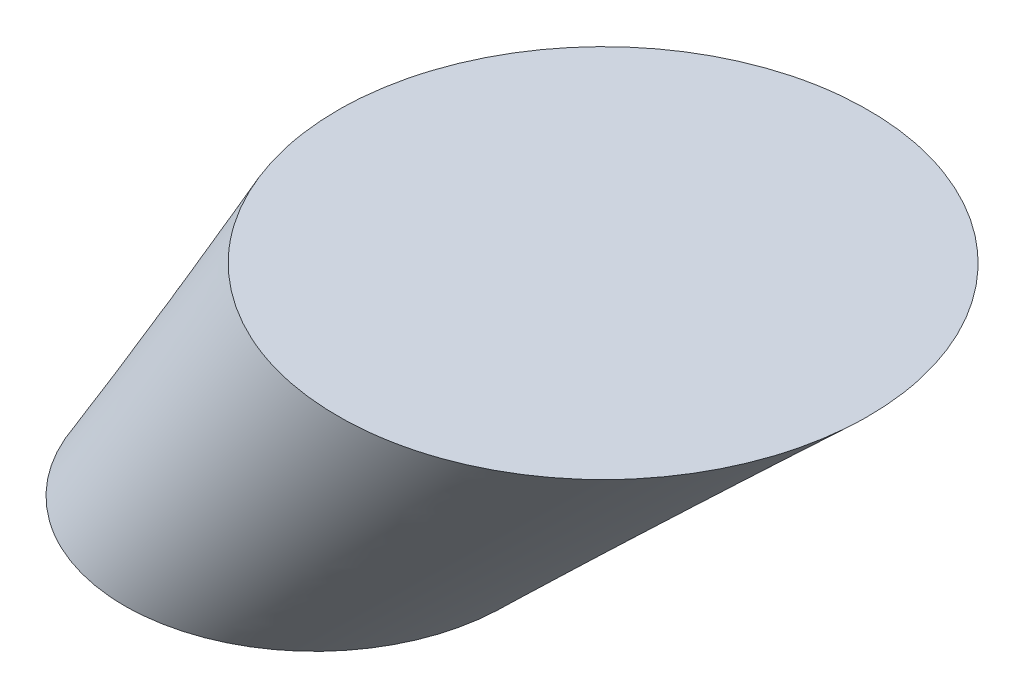
ISO-10303-21;
HEADER;
FILE_DESCRIPTION(('STEP AP214'),'2;1');
FILE_NAME('part.step','',(''),(''),'','','');
FILE_SCHEMA(('AUTOMOTIVE_DESIGN { 1 0 10303 214 1 1 1 1 }'));
ENDSEC;
DATA;
#1=APPLICATION_CONTEXT('core data for automotive mechanical design processes');
#2=APPLICATION_PROTOCOL_DEFINITION('international standard','automotive_design',2000,#1);
#3=PRODUCT_CONTEXT('',#1,'mechanical');
#4=PRODUCT('Part','Part','',(#3));
#5=PRODUCT_RELATED_PRODUCT_CATEGORY('part','',(#4));
#6=PRODUCT_DEFINITION_FORMATION('','',#4);
#7=PRODUCT_DEFINITION_CONTEXT('part definition',#1,'design');
#8=PRODUCT_DEFINITION('design','',#6,#7);
#9=PRODUCT_DEFINITION_SHAPE('','',#8);
#10=(LENGTH_UNIT() NAMED_UNIT(*) SI_UNIT(.MILLI.,.METRE.));
#11=(NAMED_UNIT(*) PLANE_ANGLE_UNIT() SI_UNIT($,.RADIAN.));
#12=(NAMED_UNIT(*) SI_UNIT($,.STERADIAN.) SOLID_ANGLE_UNIT());
#13=UNCERTAINTY_MEASURE_WITH_UNIT(LENGTH_MEASURE(1.E-05),#10,'distance_accuracy_value','');
#14=(GEOMETRIC_REPRESENTATION_CONTEXT(3) GLOBAL_UNCERTAINTY_ASSIGNED_CONTEXT((#13)) GLOBAL_UNIT_ASSIGNED_CONTEXT((#10,
#11,#12)) REPRESENTATION_CONTEXT('',''));
#15=CARTESIAN_POINT('',(0.,0.,0.));
#16=DIRECTION('',(0.,0.,1.));
#17=DIRECTION('',(1.,0.,0.));
#18=AXIS2_PLACEMENT_3D('',#15,#16,#17);
#19=CARTESIAN_POINT('',(0.,0.,0.));
#20=DIRECTION('',(0.,1.,0.));
#21=DIRECTION('',(0.,0.,1.));
#22=AXIS2_PLACEMENT_3D('',#19,#20,#21);
#23=PLANE('',#22);
#24=CARTESIAN_POINT('',(0.,0.,0.));
#25=DIRECTION('',(0.,1.,0.));
#26=DIRECTION('',(0.,0.,1.));
#27=AXIS2_PLACEMENT_3D('',#24,#25,#26);
#28=CIRCLE('',#27,23.);
#29=CARTESIAN_POINT('',(1.0525513510452,0.,-22.9759033696917));
#30=VERTEX_POINT('',#29);
#31=EDGE_CURVE('E11',#30,#30,#28,.T.);
#32=ORIENTED_EDGE('',*,*,#31,.T.);
#33=EDGE_LOOP('',(#32));
#34=FACE_BOUND('',#33,.T.);
#35=ADVANCED_FACE('F43',(#34),#23,.T.);
#36=CARTESIAN_POINT('',(-25.0000000000002,-29.9999999999998,0.));
#37=DIRECTION('',(0.,-1.,0.));
#38=DIRECTION('',(1.,0.,0.));
#39=AXIS2_PLACEMENT_3D('',#36,#37,#38);
#40=PLANE('',#39);
#41=CARTESIAN_POINT('',(-25.0000000000002,-29.9999999999998,0.));
#42=DIRECTION('',(0.,-1.,0.));
#43=DIRECTION('',(1.,0.,0.));
#44=AXIS2_PLACEMENT_3D('',#41,#42,#43);
#45=CIRCLE('',#44,16.5);
#46=CARTESIAN_POINT('',(-20.6660977349119,-29.9999999999999,-15.9206561157718));
#47=VERTEX_POINT('',#46);
#48=EDGE_CURVE('E51',#47,#47,#45,.T.);
#49=ORIENTED_EDGE('',*,*,#48,.T.);
#50=EDGE_LOOP('',(#49));
#51=FACE_BOUND('',#50,.T.);
#52=ADVANCED_FACE('F73',(#51),#40,.T.);
#53=CARTESIAN_POINT('',(-20.6660977349119,-29.9999999999999,-15.9206561157718));
#54=CARTESIAN_POINT('',(1.0525513510452,0.,-22.9759033696917));
#55=CARTESIAN_POINT('',(-21.3294584064024,-29.9999999999998,-16.1012353768172));
#56=CARTESIAN_POINT('',(0.0952220439747073,0.,-23.0197596759853));
#57=CARTESIAN_POINT('',(-22.0458919478098,-29.9999999999999,-16.2520680040292));
#58=CARTESIAN_POINT('',(-0.925255639325973,0.,-23.0070057051759));
#59=CARTESIAN_POINT('',(-23.5897326193886,-29.9999999999998,-16.4580562250464));
#60=CARTESIAN_POINT('',(-3.08806824082118,0.,-22.8175862890038));
#61=CARTESIAN_POINT('',(-24.4173803376454,-29.9999999999998,-16.5131751740553));
#62=CARTESIAN_POINT('',(-4.23071929380648,0.,-22.6407978076773));
#63=CARTESIAN_POINT('',(-26.1770947382177,-29.9999999999998,-16.481469836676));
#64=CARTESIAN_POINT('',(-6.61488799921413,0.,-22.0623654187162));
#65=CARTESIAN_POINT('',(-27.1094493502356,-29.9999999999998,-16.3944465528839));
#66=CARTESIAN_POINT('',(-7.85673679981556,0.,-21.6603632188023));
#67=CARTESIAN_POINT('',(-29.0522002521926,-29.9999999999998,-16.0252091235249));
#68=CARTESIAN_POINT('',(-10.3872210279229,0.,-20.5670923377393));
#69=CARTESIAN_POINT('',(-30.0628141072813,-29.9999999999998,-15.7425510421633));
#70=CARTESIAN_POINT('',(-11.6760173738869,0.,-19.8751535691125));
#71=CARTESIAN_POINT('',(-32.107729607504,-29.9999999999998,-14.9311814611776));
#72=CARTESIAN_POINT('',(-14.2109845080709,0.,-18.1493534436486));
#73=CARTESIAN_POINT('',(-33.1419543637754,-29.9999999999998,-14.4017971047897));
#74=CARTESIAN_POINT('',(-15.4568460191973,0.,-17.1146001609598));
#75=CARTESIAN_POINT('',(-35.1486970785049,-29.9999999999998,-13.0654938030706));
#76=CARTESIAN_POINT('',(-17.7802011173199,0.,-14.6863227445933));
#77=CARTESIAN_POINT('',(-36.1206166929638,-29.9999999999998,-12.257920902527));
#78=CARTESIAN_POINT('',(-18.8566818197173,0.,-13.2920910234508));
#79=CARTESIAN_POINT('',(-37.8956919677274,-29.9999999999997,-10.3742888507082));
#80=CARTESIAN_POINT('',(-20.6983934434609,0.,-10.18973217928));
#81=CARTESIAN_POINT('',(-38.6977691413284,-29.9999999999997,-9.29806538798053));
#82=CARTESIAN_POINT('',(-21.4621072707619,0.,-8.48170961039923));
#83=CARTESIAN_POINT('',(-40.0301969833555,-29.9999999999997,-6.94089893672445));
#84=CARTESIAN_POINT('',(-22.557618596126,0.,-4.8698346674751));
#85=CARTESIAN_POINT('',(-40.5594975936814,-29.9999999999997,-5.66062360806928));
#86=CARTESIAN_POINT('',(-22.8881907571047,0.,-2.96720996518618));
#87=CARTESIAN_POINT('',(-41.2818146378627,-29.9999999999997,-3.00718092210731));
#88=CARTESIAN_POINT('',(-23.0636159822789,0.,0.862107263095771));
#89=CARTESIAN_POINT('',(-41.4744891464902,-29.9999999999997,-1.63526963234416));
#90=CARTESIAN_POINT('',(-22.9083860049477,0.,2.78698709454288));
#91=CARTESIAN_POINT('',(-41.5207038238191,-29.9999999999997,1.07202825239912));
#92=CARTESIAN_POINT('',(-22.1476981152771,0.,6.48389656081773));
#93=CARTESIAN_POINT('',(-41.3748107410854,-29.9999999999997,2.40630706229899));
#94=CARTESIAN_POINT('',(-21.543348161255,0.,8.25459163306771));
#95=CARTESIAN_POINT('',(-40.799431595066,-29.9999999999997,4.92977704944809));
#96=CARTESIAN_POINT('',(-19.9930002333024,0.,11.5123444483271));
#97=CARTESIAN_POINT('',(-40.3709584930705,-29.9999999999997,6.11856320663901));
#98=CARTESIAN_POINT('',(-19.0485034396152,0.,12.999159366731));
#99=CARTESIAN_POINT('',(-39.3184495916337,-29.9999999999997,8.28765238177718));
#100=CARTESIAN_POINT('',(-16.9568979352675,0.,15.6296909740284));
#101=CARTESIAN_POINT('',(-38.6952610504383,-29.9999999999997,9.26821583479557));
#102=CARTESIAN_POINT('',(-15.8108625616596,0.,16.7740196782829));
#103=CARTESIAN_POINT('',(-37.3437699126296,-29.9999999999997,11.0041512323334));
#104=CARTESIAN_POINT('',(-13.4443036436428,0.,18.7243640919697));
#105=CARTESIAN_POINT('',(-36.615874650953,-29.9999999999997,11.7600642187841));
#106=CARTESIAN_POINT('',(-12.2241696299743,0.,19.5312397140999));
#107=CARTESIAN_POINT('',(-35.1283448933657,-29.9999999999998,13.063088610953));
#108=CARTESIAN_POINT('',(-9.80424249365706,0.,20.8512943731939));
#109=CARTESIAN_POINT('',(-34.36874787287,-29.9999999999998,13.6106929762815));
#110=CARTESIAN_POINT('',(-8.6043503928697,0.,21.3651554037838));
#111=CARTESIAN_POINT('',(-32.8679119009322,-29.9999999999998,14.5299814975509));
#112=CARTESIAN_POINT('',(-6.28305408816448,0.,22.159150309439));
#113=CARTESIAN_POINT('',(-32.1265256158254,-29.9999999999998,14.9019831377771));
#114=CARTESIAN_POINT('',(-5.16135288186503,0.,22.4396712530502));
#115=CARTESIAN_POINT('',(-30.6912955421656,-29.9999999999998,15.5069540478887));
#116=CARTESIAN_POINT('',(-3.02491794755868,0.,22.8260439175657));
#117=CARTESIAN_POINT('',(-29.997262936579,-29.9999999999998,15.7400768547265));
#118=CARTESIAN_POINT('',(-2.0098806581157,0.,22.9320470633982));
#119=CARTESIAN_POINT('',(-28.670541593598,-29.9999999999998,16.1012353768172));
#120=CARTESIAN_POINT('',(-0.0952220439747204,0.,23.0197596759853));
#121=CARTESIAN_POINT('',(-27.9541080521906,-29.9999999999998,16.2520680040292));
#122=CARTESIAN_POINT('',(0.925255639325959,0.,23.0070057051759));
#123=CARTESIAN_POINT('',(-26.4102673806118,-29.9999999999998,16.4580562250464));
#124=CARTESIAN_POINT('',(3.08806824082117,0.,22.8175862890038));
#125=CARTESIAN_POINT('',(-25.582619662355,-29.9999999999998,16.5131751740553));
#126=CARTESIAN_POINT('',(4.23071929380645,0.,22.6407978076773));
#127=CARTESIAN_POINT('',(-23.8229052617827,-29.9999999999998,16.481469836676));
#128=CARTESIAN_POINT('',(6.61488799921412,0.,22.0623654187162));
#129=CARTESIAN_POINT('',(-22.8905506497648,-29.9999999999998,16.3944465528838));
#130=CARTESIAN_POINT('',(7.85673679981555,0.,21.6603632188023));
#131=CARTESIAN_POINT('',(-20.9477997478078,-29.9999999999999,16.0252091235249));
#132=CARTESIAN_POINT('',(10.3872210279229,0.,20.5670923377393));
#133=CARTESIAN_POINT('',(-19.9371858927191,-29.9999999999999,15.7425510421633));
#134=CARTESIAN_POINT('',(11.6760173738869,0.,19.8751535691125));
#135=CARTESIAN_POINT('',(-17.8922703924964,-29.9999999999999,14.9311814611776));
#136=CARTESIAN_POINT('',(14.2109845080709,0.,18.1493534436486));
#137=CARTESIAN_POINT('',(-16.8580456362251,-29.9999999999999,14.4017971047897));
#138=CARTESIAN_POINT('',(15.4568460191973,0.,17.1146001609599));
#139=CARTESIAN_POINT('',(-14.8513029214956,-29.9999999999999,13.0654938030707));
#140=CARTESIAN_POINT('',(17.7802011173199,0.,14.6863227445933));
#141=CARTESIAN_POINT('',(-13.8793833070366,-29.9999999999999,12.257920902527));
#142=CARTESIAN_POINT('',(18.8566818197173,0.,13.2920910234508));
#143=CARTESIAN_POINT('',(-12.1043080322731,-29.9999999999999,10.3742888507082));
#144=CARTESIAN_POINT('',(20.6983934434609,0.,10.18973217928));
#145=CARTESIAN_POINT('',(-11.302230858672,-29.9999999999999,9.29806538798053));
#146=CARTESIAN_POINT('',(21.4621072707619,0.,8.48170961039926));
#147=CARTESIAN_POINT('',(-9.96980301664496,-29.9999999999999,6.94089893672446));
#148=CARTESIAN_POINT('',(22.557618596126,0.,4.8698346674751));
#149=CARTESIAN_POINT('',(-9.4405024063191,-29.9999999999999,5.66062360806929));
#150=CARTESIAN_POINT('',(22.8881907571046,0.,2.96720996518618));
#151=CARTESIAN_POINT('',(-8.7181853621377,-29.9999999999999,3.00718092210732));
#152=CARTESIAN_POINT('',(23.0636159822789,0.,-0.862107263095769));
#153=CARTESIAN_POINT('',(-8.5255108535102,-29.9999999999999,1.63526963234416));
#154=CARTESIAN_POINT('',(22.9083860049477,0.,-2.78698709454288));
#155=CARTESIAN_POINT('',(-8.47929617618138,-29.9999999999999,-1.07202825239911));
#156=CARTESIAN_POINT('',(22.1476981152771,0.,-6.48389656081773));
#157=CARTESIAN_POINT('',(-8.62518925891502,-29.9999999999999,-2.40630706229899));
#158=CARTESIAN_POINT('',(21.543348161255,0.,-8.25459163306771));
#159=CARTESIAN_POINT('',(-9.20056840493438,-29.9999999999999,-4.92977704944807));
#160=CARTESIAN_POINT('',(19.9930002333024,0.,-11.5123444483271));
#161=CARTESIAN_POINT('',(-9.62904150692992,-29.9999999999999,-6.118563206639));
#162=CARTESIAN_POINT('',(19.0485034396152,0.,-12.999159366731));
#163=CARTESIAN_POINT('',(-10.6815504083667,-29.9999999999999,-8.28765238177717));
#164=CARTESIAN_POINT('',(16.9568979352675,0.,-15.6296909740284));
#165=CARTESIAN_POINT('',(-11.3047389495622,-29.9999999999999,-9.26821583479556));
#166=CARTESIAN_POINT('',(15.8108625616596,0.,-16.7740196782829));
#167=CARTESIAN_POINT('',(-12.6562300873708,-29.9999999999999,-11.0041512323334));
#168=CARTESIAN_POINT('',(13.4443036436428,0.,-18.7243640919697));
#169=CARTESIAN_POINT('',(-13.3841253490474,-29.9999999999999,-11.7600642187841));
#170=CARTESIAN_POINT('',(12.2241696299743,0.,-19.5312397140999));
#171=CARTESIAN_POINT('',(-14.8716551066347,-29.9999999999999,-13.063088610953));
#172=CARTESIAN_POINT('',(9.80424249365705,0.,-20.8512943731939));
#173=CARTESIAN_POINT('',(-15.6312521271305,-29.9999999999999,-13.6106929762815));
#174=CARTESIAN_POINT('',(8.6043503928697,0.,-21.3651554037838));
#175=CARTESIAN_POINT('',(-17.1320880990682,-29.9999999999999,-14.5299814975509));
#176=CARTESIAN_POINT('',(6.28305408816448,0.,-22.159150309439));
#177=CARTESIAN_POINT('',(-17.873474384175,-29.9999999999999,-14.9019831377771));
#178=CARTESIAN_POINT('',(5.16135288186502,0.,-22.4396712530502));
#179=CARTESIAN_POINT('',(-19.3087044578348,-29.9999999999999,-15.5069540478887));
#180=CARTESIAN_POINT('',(3.02491794755868,0.,-22.8260439175657));
#181=CARTESIAN_POINT('',(-20.0027370634214,-29.9999999999999,-15.7400768547265));
#182=CARTESIAN_POINT('',(2.00988065811569,0.,-22.9320470633982));
#183=CARTESIAN_POINT('',(-20.6660977349119,-29.9999999999999,-15.9206561157718));
#184=CARTESIAN_POINT('',(1.0525513510452,0.,-22.9759033696917));
#185=B_SPLINE_SURFACE_WITH_KNOTS('',3,1,((#53,#54),(#55,#56),(#57,#58),(#59,#60),(#61,#62),(#63,
#64),(#65,#66),(#67,#68),(#69,#70),(#71,#72),(#73,#74),(#75,#76),(#77,#78),(#79,#80),(#81,#82),
(#83,#84),(#85,#86),(#87,#88),(#89,#90),(#91,#92),(#93,#94),(#95,#96),(#97,#98),(#99,#100),
(#101,#102),(#103,#104),(#105,#106),(#107,#108),(#109,#110),(#111,#112),(#113,#114),(#115,#116),
(#117,#118),(#119,#120),(#121,#122),(#123,#124),(#125,#126),(#127,#128),(#129,#130),(#131,#132),
(#133,#134),(#135,#136),(#137,#138),(#139,#140),(#141,#142),(#143,#144),(#145,#146),(#147,#148),
(#149,#150),(#151,#152),(#153,#154),(#155,#156),(#157,#158),(#159,#160),(#161,#162),(#163,#164),
(#165,#166),(#167,#168),(#169,#170),(#171,#172),(#173,#174),(#175,#176),(#177,#178),(#179,#180),
(#181,#182),(#183,#184)),.UNSPECIFIED.,.T.,.F.,.F.,(4,2,2,2,2,2,2,2,2,2,2,2,2,2,2,2,2,2,2,2,2,2,
2,2,2,2,2,2,2,2,2,2,4),(2,2),(0.,0.03125,0.0625,0.09375,0.125,0.15625,0.1875,0.21875,0.25,
0.28125,0.312499999999999,0.343749999999999,0.374999999999999,0.406249999999999,
0.437499999999999,0.468749999999999,0.499999999999999,0.531249999999999,0.562499999999999,
0.593749999999999,0.624999999999999,0.656249999999999,0.687499999999999,0.718749999999999,0.75,
0.78125,0.8125,0.84375,0.875,0.90625,0.9375,0.96875,1.),(0.,1.),.UNSPECIFIED.);
#186=CARTESIAN_POINT('',(-20.6660977349119,-29.9999999999999,-15.9206561157718));
#187=CARTESIAN_POINT('',(-20.4398618069332,-29.6874999999999,-15.9941482746668));
#188=CARTESIAN_POINT('',(-20.2136258789545,-29.3749999999999,-16.0676404335618));
#189=CARTESIAN_POINT('',(-19.761154022997,-28.7499999999999,-16.2146247513518));
#190=CARTESIAN_POINT('',(-19.5349180950183,-28.4374999999999,-16.2881169102468));
#191=CARTESIAN_POINT('',(-19.0824462390609,-27.8124999999999,-16.4351012280368));
#192=CARTESIAN_POINT('',(-18.8562103110822,-27.4999999999999,-16.5085933869318));
#193=CARTESIAN_POINT('',(-18.4037384551247,-26.8749999999999,-16.6555777047218));
#194=CARTESIAN_POINT('',(-18.177502527146,-26.5624999999999,-16.7290698636168));
#195=CARTESIAN_POINT('',(-17.7250306711886,-25.9374999999999,-16.8760541814068));
#196=CARTESIAN_POINT('',(-17.4987947432098,-25.6249999999999,-16.9495463403018));
#197=CARTESIAN_POINT('',(-17.0463228872524,-24.9999999999999,-17.0965306580918));
#198=CARTESIAN_POINT('',(-16.8200869592737,-24.6874999999999,-17.1700228169868));
#199=CARTESIAN_POINT('',(-16.3676151033162,-24.0624999999999,-17.3170071347768));
#200=CARTESIAN_POINT('',(-16.1413791753375,-23.7499999999999,-17.3904992936718));
#201=CARTESIAN_POINT('',(-15.6889073193801,-23.1249999999999,-17.5374836114618));
#202=CARTESIAN_POINT('',(-15.4626713914014,-22.8124999999999,-17.6109757703568));
#203=CARTESIAN_POINT('',(-15.0101995354439,-22.1874999999999,-17.7579600881468));
#204=CARTESIAN_POINT('',(-14.7839636074652,-21.8749999999999,-17.8314522470418));
#205=CARTESIAN_POINT('',(-14.3314917515078,-21.2499999999999,-17.9784365648318));
#206=CARTESIAN_POINT('',(-14.105255823529,-20.9374999999999,-18.0519287237268));
#207=CARTESIAN_POINT('',(-13.6527839675716,-20.3124999999999,-18.1989130415168));
#208=CARTESIAN_POINT('',(-13.4265480395929,-19.9999999999999,-18.2724052004118));
#209=CARTESIAN_POINT('',(-12.9740761836354,-19.3749999999999,-18.4193895182018));
#210=CARTESIAN_POINT('',(-12.7478402556567,-19.0624999999999,-18.4928816770968));
#211=CARTESIAN_POINT('',(-12.2953683996993,-18.4374999999999,-18.6398659948868));
#212=CARTESIAN_POINT('',(-12.0691324717206,-18.1249999999999,-18.7133581537818));
#213=CARTESIAN_POINT('',(-11.6166606157631,-17.4999999999999,-18.8603424715718));
#214=CARTESIAN_POINT('',(-11.3904246877844,-17.1874999999999,-18.9338346304668));
#215=CARTESIAN_POINT('',(-10.937952831827,-16.5624999999999,-19.0808189482568));
#216=CARTESIAN_POINT('',(-10.7117169038482,-16.2499999999999,-19.1543111071518));
#217=CARTESIAN_POINT('',(-10.2592450478908,-15.6249999999999,-19.3012954249418));
#218=CARTESIAN_POINT('',(-10.0330091199121,-15.3124999999999,-19.3747875838368));
#219=CARTESIAN_POINT('',(-9.58053726395464,-14.6874999999999,-19.5217719016268));
#220=CARTESIAN_POINT('',(-9.35430133597592,-14.3749999999999,-19.5952640605218));
#221=CARTESIAN_POINT('',(-8.90182948001848,-13.7499999999999,-19.7422483783118));
#222=CARTESIAN_POINT('',(-8.67559355203976,-13.4374999999999,-19.8157405372068));
#223=CARTESIAN_POINT('',(-8.22312169608232,-12.8124999999999,-19.9627248549968));
#224=CARTESIAN_POINT('',(-7.9968857681036,-12.4999999999999,-20.0362170138918));
#225=CARTESIAN_POINT('',(-7.54441391214616,-11.8749999999999,-20.1832013316818));
#226=CARTESIAN_POINT('',(-7.31817798416744,-11.5624999999999,-20.2566934905768));
#227=CARTESIAN_POINT('',(-6.86570612821,-10.9374999999999,-20.4036778083668));
#228=CARTESIAN_POINT('',(-6.63947020023128,-10.625,-20.4771699672618));
#229=CARTESIAN_POINT('',(-6.18699834427384,-9.99999999999995,-20.6241542850518));
#230=CARTESIAN_POINT('',(-5.96076241629512,-9.68749999999996,-20.6976464439468));
#231=CARTESIAN_POINT('',(-5.50829056033768,-9.06249999999996,-20.8446307617368));
#232=CARTESIAN_POINT('',(-5.28205463235896,-8.74999999999996,-20.9181229206318));
#233=CARTESIAN_POINT('',(-4.82958277640152,-8.12499999999996,-21.0651072384218));
#234=CARTESIAN_POINT('',(-4.6033468484228,-7.81249999999996,-21.1385993973168));
#235=CARTESIAN_POINT('',(-4.15087499246536,-7.18749999999997,-21.2855837151068));
#236=CARTESIAN_POINT('',(-3.92463906448664,-6.87499999999997,-21.3590758740018));
#237=CARTESIAN_POINT('',(-3.4721672085292,-6.24999999999997,-21.5060601917918));
#238=CARTESIAN_POINT('',(-3.24593128055048,-5.93749999999997,-21.5795523506868));
#239=CARTESIAN_POINT('',(-2.79345942459304,-5.31249999999998,-21.7265366684768));
#240=CARTESIAN_POINT('',(-2.56722349661432,-4.99999999999998,-21.8000288273718));
#241=CARTESIAN_POINT('',(-2.11475164065688,-4.37499999999998,-21.9470131451617));
#242=CARTESIAN_POINT('',(-1.88851571267816,-4.06249999999998,-22.0205053040567));
#243=CARTESIAN_POINT('',(-1.43604385672072,-3.43749999999998,-22.1674896218468));
#244=CARTESIAN_POINT('',(-1.209807928742,-3.12499999999999,-22.2409817807418));
#245=CARTESIAN_POINT('',(-0.757336072784559,-2.49999999999999,-22.3879660985318));
#246=CARTESIAN_POINT('',(-0.531100144805839,-2.18749999999999,-22.4614582574267));
#247=CARTESIAN_POINT('',(-0.0786282888483986,-1.56249999999999,-22.6084425752167));
#248=CARTESIAN_POINT('',(0.147607639130321,-1.24999999999999,-22.6819347341117));
#249=CARTESIAN_POINT('',(0.600079495087761,-0.624999999999997,-22.8289190519017));
#250=CARTESIAN_POINT('',(0.826315423066481,-0.312499999999999,-22.9024112107967));
#251=CARTESIAN_POINT('',(1.0525513510452,0.,-22.9759033696917));
#252=B_SPLINE_CURVE_WITH_KNOTS('',3,(#186,#187,#188,#189,#190,#191,#192,#193,#194,#195,#196,
#197,#198,#199,#200,#201,#202,#203,#204,#205,#206,#207,#208,#209,#210,#211,#212,#213,#214,#215,
#216,#217,#218,#219,#220,#221,#222,#223,#224,#225,#226,#227,#228,#229,#230,#231,#232,#233,#234,
#235,#236,#237,#238,#239,#240,#241,#242,#243,#244,#245,#246,#247,#248,#249,#250,#251),
.UNSPECIFIED.,.F.,.F.,(4,2,2,2,2,2,2,2,2,2,2,2,2,2,2,2,2,2,2,2,2,2,2,2,2,2,2,2,2,2,2,2,4),(0.,
1.17820218245722,2.35640436491444,3.53460654737166,4.71280872982888,5.8910109122861,
7.06921309474332,8.24741527720054,9.42561745965775,10.603819642115,11.7820218245722,
12.9602240070294,14.1384261894866,15.3166283719439,16.4948305544011,17.6730327368583,
18.8512349193155,20.0294371017727,21.2076392842299,22.3858414666872,23.5640436491444,
24.7422458316016,25.9204480140588,27.098650196516,28.2768523789733,29.4550545614305,
30.6332567438877,31.8114589263449,32.9896611088021,34.1678632912594,35.3460654737166,
36.5242676561738,37.702469838631),.UNSPECIFIED.);
#253=EDGE_CURVE('BSEAM81',#47,#30,#252,.T.);
#254=ORIENTED_EDGE('',*,*,#48,.F.);
#255=ORIENTED_EDGE('',*,*,#31,.F.);
#256=ORIENTED_EDGE('',*,*,#253,.T.);
#257=ORIENTED_EDGE('',*,*,#253,.F.);
#258=EDGE_LOOP('',(#254,#256,#255,#257));
#259=FACE_BOUND('',#258,.T.);
#260=ADVANCED_FACE('F81',(#259),#185,.T.);
#261=CLOSED_SHELL('',(#35,#52,#260));
#262=MANIFOLD_SOLID_BREP('B2',#261);
#263=ADVANCED_BREP_SHAPE_REPRESENTATION('',(#18,#262),#14);
#264=SHAPE_DEFINITION_REPRESENTATION(#9,#263);
ENDSEC;
END-ISO-10303-21;
